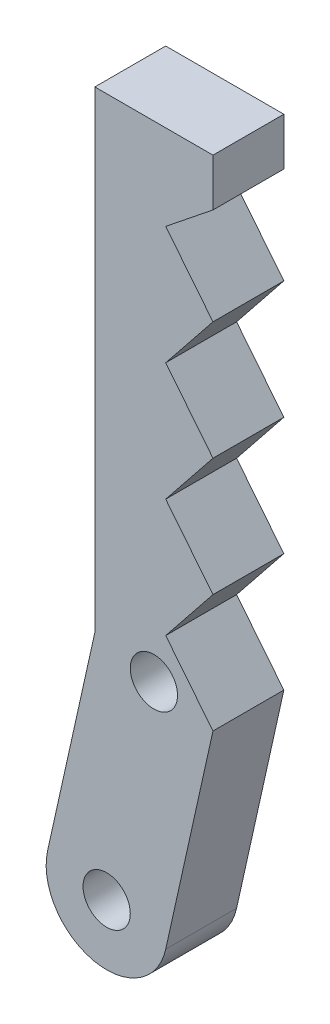
ISO-10303-21;
HEADER;
FILE_DESCRIPTION(('STEP AP214'),'2;1');
FILE_NAME('part.step','',(''),(''),'','','');
FILE_SCHEMA(('AUTOMOTIVE_DESIGN { 1 0 10303 214 1 1 1 1 }'));
ENDSEC;
DATA;
#1=APPLICATION_CONTEXT('core data for automotive mechanical design processes');
#2=APPLICATION_PROTOCOL_DEFINITION('international standard','automotive_design',2000,#1);
#3=PRODUCT_CONTEXT('',#1,'mechanical');
#4=PRODUCT('Part','Part','',(#3));
#5=PRODUCT_RELATED_PRODUCT_CATEGORY('part','',(#4));
#6=PRODUCT_DEFINITION_FORMATION('','',#4);
#7=PRODUCT_DEFINITION_CONTEXT('part definition',#1,'design');
#8=PRODUCT_DEFINITION('design','',#6,#7);
#9=PRODUCT_DEFINITION_SHAPE('','',#8);
#10=(LENGTH_UNIT() NAMED_UNIT(*) SI_UNIT(.MILLI.,.METRE.));
#11=(NAMED_UNIT(*) PLANE_ANGLE_UNIT() SI_UNIT($,.RADIAN.));
#12=(NAMED_UNIT(*) SI_UNIT($,.STERADIAN.) SOLID_ANGLE_UNIT());
#13=UNCERTAINTY_MEASURE_WITH_UNIT(LENGTH_MEASURE(1.E-05),#10,'distance_accuracy_value','');
#14=(GEOMETRIC_REPRESENTATION_CONTEXT(3) GLOBAL_UNCERTAINTY_ASSIGNED_CONTEXT((#13)) GLOBAL_UNIT_ASSIGNED_CONTEXT((#10,
#11,#12)) REPRESENTATION_CONTEXT('',''));
#15=CARTESIAN_POINT('',(0.,0.,0.));
#16=DIRECTION('',(0.,0.,1.));
#17=DIRECTION('',(1.,0.,0.));
#18=AXIS2_PLACEMENT_3D('',#15,#16,#17);
#19=CARTESIAN_POINT('',(-9.00000033147397,-18.981520896105,6.));
#20=DIRECTION('',(0.,0.,1.));
#21=DIRECTION('',(1.,0.,0.));
#22=AXIS2_PLACEMENT_3D('',#19,#20,#21);
#23=PLANE('',#22);
#24=CARTESIAN_POINT('',(-5.,-0.983289603235069,6.));
#25=DIRECTION('',(0.,0.,1.));
#26=DIRECTION('',(1.,0.,0.));
#27=AXIS2_PLACEMENT_3D('',#24,#25,#26);
#28=CIRCLE('',#27,2.);
#29=CARTESIAN_POINT('',(-3.,-0.983289603235069,6.));
#30=VERTEX_POINT('',#29);
#31=EDGE_CURVE('E170',#30,#30,#28,.T.);
#32=ORIENTED_EDGE('',*,*,#31,.F.);
#33=EDGE_LOOP('',(#32));
#34=FACE_BOUND('',#33,.T.);
#35=DIRECTION('',(-1.,0.,0.));
#36=VECTOR('',#35,1.);
#37=CARTESIAN_POINT('',(0.,40.1279306935094,6.));
#38=LINE('',#37,#36);
#39=CARTESIAN_POINT('',(0.,40.1279306935094,6.));
#40=VERTEX_POINT('',#39);
#41=CARTESIAN_POINT('',(-10.,40.1279306935094,6.));
#42=VERTEX_POINT('',#41);
#43=EDGE_CURVE('E193',#40,#42,#38,.T.);
#44=ORIENTED_EDGE('',*,*,#43,.T.);
#45=DIRECTION('',(0.,-1.,0.));
#46=VECTOR('',#45,1.);
#47=CARTESIAN_POINT('',(-10.,40.1279306935094,6.));
#48=LINE('',#47,#46);
#49=CARTESIAN_POINT('',(-10.,0.127930693509376,6.));
#50=VERTEX_POINT('',#49);
#51=EDGE_CURVE('E111',#42,#50,#48,.T.);
#52=ORIENTED_EDGE('',*,*,#51,.T.);
#53=DIRECTION('',(-0.216950771639621,-0.976182545779719,0.));
#54=VECTOR('',#53,1.);
#55=CARTESIAN_POINT('',(-10.,0.127930693509376,6.));
#56=LINE('',#55,#54);
#57=CARTESIAN_POINT('',(-14.0005722290346,-17.8728754506686,6.));
#58=VERTEX_POINT('',#57);
#59=EDGE_CURVE('E226',#50,#58,#56,.T.);
#60=ORIENTED_EDGE('',*,*,#59,.T.);
#61=CARTESIAN_POINT('',(-9.00000033147397,-18.981520896105,6.));
#62=DIRECTION('',(0.,0.,1.));
#63=DIRECTION('',(1.,0.,0.));
#64=AXIS2_PLACEMENT_3D('',#61,#62,#63);
#65=CIRCLE('',#64,5.12199316930039);
#66=CARTESIAN_POINT('',(-3.99999999999999,-20.0927412665176,6.));
#67=VERTEX_POINT('',#66);
#68=EDGE_CURVE('E245',#58,#67,#65,.T.);
#69=ORIENTED_EDGE('',*,*,#68,.T.);
#70=DIRECTION('',(0.216950771639622,0.976182545779719,0.));
#71=VECTOR('',#70,1.);
#72=CARTESIAN_POINT('',(0.,-2.09450989997951,6.));
#73=LINE('',#72,#71);
#74=CARTESIAN_POINT('',(0.,-2.09450989997951,6.));
#75=VERTEX_POINT('',#74);
#76=EDGE_CURVE('E242',#67,#75,#73,.T.);
#77=ORIENTED_EDGE('',*,*,#76,.T.);
#78=DIRECTION('',(-0.624695047554424,0.780868809443031,0.));
#79=VECTOR('',#78,1.);
#80=CARTESIAN_POINT('',(0.,-2.09450989997951,6.));
#81=LINE('',#80,#79);
#82=CARTESIAN_POINT('',(-4.,2.90549010002049,6.));
#83=VERTEX_POINT('',#82);
#84=EDGE_CURVE('E244',#75,#83,#81,.T.);
#85=ORIENTED_EDGE('',*,*,#84,.T.);
#86=DIRECTION('',(0.624695047554424,0.78086880944303,0.));
#87=VECTOR('',#86,1.);
#88=CARTESIAN_POINT('',(-4.,2.90549010002049,6.));
#89=LINE('',#88,#87);
#90=CARTESIAN_POINT('',(0.,7.90549010002049,6.));
#91=VERTEX_POINT('',#90);
#92=EDGE_CURVE('E247',#83,#91,#89,.T.);
#93=ORIENTED_EDGE('',*,*,#92,.T.);
#94=DIRECTION('',(-0.624695047554424,0.780868809443031,0.));
#95=VECTOR('',#94,1.);
#96=CARTESIAN_POINT('',(0.,7.90549010002049,6.));
#97=LINE('',#96,#95);
#98=CARTESIAN_POINT('',(-3.99999999999999,12.9054901000205,6.));
#99=VERTEX_POINT('',#98);
#100=EDGE_CURVE('E253',#91,#99,#97,.T.);
#101=ORIENTED_EDGE('',*,*,#100,.T.);
#102=DIRECTION('',(0.624695047554423,0.780868809443031,0.));
#103=VECTOR('',#102,1.);
#104=CARTESIAN_POINT('',(-3.99999999999999,12.9054901000205,6.));
#105=LINE('',#104,#103);
#106=CARTESIAN_POINT('',(0.,17.9054901000205,6.));
#107=VERTEX_POINT('',#106);
#108=EDGE_CURVE('E255',#99,#107,#105,.T.);
#109=ORIENTED_EDGE('',*,*,#108,.T.);
#110=DIRECTION('',(-0.624695047554424,0.780868809443031,0.));
#111=VECTOR('',#110,1.);
#112=CARTESIAN_POINT('',(0.,17.9054901000205,6.));
#113=LINE('',#112,#111);
#114=CARTESIAN_POINT('',(-3.99999999999999,22.9054901000205,6.));
#115=VERTEX_POINT('',#114);
#116=EDGE_CURVE('E257',#107,#115,#113,.T.);
#117=ORIENTED_EDGE('',*,*,#116,.T.);
#118=DIRECTION('',(0.624695047554423,0.780868809443031,0.));
#119=VECTOR('',#118,1.);
#120=CARTESIAN_POINT('',(-3.99999999999999,22.9054901000205,6.));
#121=LINE('',#120,#119);
#122=CARTESIAN_POINT('',(0.,27.9054901000205,6.));
#123=VERTEX_POINT('',#122);
#124=EDGE_CURVE('E148',#115,#123,#121,.T.);
#125=ORIENTED_EDGE('',*,*,#124,.T.);
#126=DIRECTION('',(-0.624695047554424,0.780868809443031,0.));
#127=VECTOR('',#126,1.);
#128=CARTESIAN_POINT('',(0.,27.9054901000205,6.));
#129=LINE('',#128,#127);
#130=CARTESIAN_POINT('',(-3.99999999999999,32.9054901000205,6.));
#131=VERTEX_POINT('',#130);
#132=EDGE_CURVE('E142',#123,#131,#129,.T.);
#133=ORIENTED_EDGE('',*,*,#132,.T.);
#134=DIRECTION('',(0.780868809443031,0.624695047554424,0.));
#135=VECTOR('',#134,1.);
#136=CARTESIAN_POINT('',(-3.99999999999999,32.9054901000205,6.));
#137=LINE('',#136,#135);
#138=CARTESIAN_POINT('',(0.,36.1054901000205,6.));
#139=VERTEX_POINT('',#138);
#140=EDGE_CURVE('E146',#131,#139,#137,.T.);
#141=ORIENTED_EDGE('',*,*,#140,.T.);
#142=DIRECTION('',(0.,1.,0.));
#143=VECTOR('',#142,1.);
#144=CARTESIAN_POINT('',(0.,36.1054901000205,6.));
#145=LINE('',#144,#143);
#146=EDGE_CURVE('E50',#139,#40,#145,.T.);
#147=ORIENTED_EDGE('',*,*,#146,.T.);
#148=EDGE_LOOP('',(#44,#52,#60,#69,#77,#85,#93,#101,#109,#117,#125,#133,#141,#147));
#149=FACE_BOUND('',#148,.T.);
#150=CARTESIAN_POINT('',(-9.00000033147397,-18.981520896105,6.));
#151=DIRECTION('',(0.,0.,1.));
#152=DIRECTION('',(1.,0.,0.));
#153=AXIS2_PLACEMENT_3D('',#150,#151,#152);
#154=CIRCLE('',#153,2.);
#155=CARTESIAN_POINT('',(-7.00000033147397,-18.981520896105,6.));
#156=VERTEX_POINT('',#155);
#157=EDGE_CURVE('E299',#156,#156,#154,.T.);
#158=ORIENTED_EDGE('',*,*,#157,.F.);
#159=EDGE_LOOP('',(#158));
#160=FACE_BOUND('',#159,.T.);
#161=ADVANCED_FACE('F33',(#34,#149,#160),#23,.T.);
#162=CARTESIAN_POINT('',(-9.00000033147397,-18.981520896105,0.));
#163=DIRECTION('',(0.,0.,1.));
#164=DIRECTION('',(1.,0.,0.));
#165=AXIS2_PLACEMENT_3D('',#162,#163,#164);
#166=PLANE('',#165);
#167=DIRECTION('',(-1.,0.,0.));
#168=VECTOR('',#167,1.);
#169=CARTESIAN_POINT('',(0.,40.1279306935094,0.));
#170=LINE('',#169,#168);
#171=CARTESIAN_POINT('',(0.,40.1279306935094,0.));
#172=VERTEX_POINT('',#171);
#173=CARTESIAN_POINT('',(-10.,40.1279306935094,0.));
#174=VERTEX_POINT('',#173);
#175=EDGE_CURVE('E166',#172,#174,#170,.T.);
#176=ORIENTED_EDGE('',*,*,#175,.F.);
#177=DIRECTION('',(0.,1.,0.));
#178=VECTOR('',#177,1.);
#179=CARTESIAN_POINT('',(0.,36.1054901000205,0.));
#180=LINE('',#179,#178);
#181=CARTESIAN_POINT('',(0.,36.1054901000205,0.));
#182=VERTEX_POINT('',#181);
#183=EDGE_CURVE('E103',#182,#172,#180,.T.);
#184=ORIENTED_EDGE('',*,*,#183,.F.);
#185=DIRECTION('',(0.780868809443031,0.624695047554424,0.));
#186=VECTOR('',#185,1.);
#187=CARTESIAN_POINT('',(-3.99999999999999,32.9054901000205,0.));
#188=LINE('',#187,#186);
#189=CARTESIAN_POINT('',(-3.99999999999999,32.9054901000205,0.));
#190=VERTEX_POINT('',#189);
#191=EDGE_CURVE('E97',#190,#182,#188,.T.);
#192=ORIENTED_EDGE('',*,*,#191,.F.);
#193=DIRECTION('',(-0.624695047554424,0.780868809443031,0.));
#194=VECTOR('',#193,1.);
#195=CARTESIAN_POINT('',(0.,27.9054901000205,0.));
#196=LINE('',#195,#194);
#197=CARTESIAN_POINT('',(0.,27.9054901000205,0.));
#198=VERTEX_POINT('',#197);
#199=EDGE_CURVE('E156',#198,#190,#196,.T.);
#200=ORIENTED_EDGE('',*,*,#199,.F.);
#201=DIRECTION('',(0.624695047554423,0.780868809443031,0.));
#202=VECTOR('',#201,1.);
#203=CARTESIAN_POINT('',(-3.99999999999999,22.9054901000205,0.));
#204=LINE('',#203,#202);
#205=CARTESIAN_POINT('',(-3.99999999999999,22.9054901000205,0.));
#206=VERTEX_POINT('',#205);
#207=EDGE_CURVE('E188',#206,#198,#204,.T.);
#208=ORIENTED_EDGE('',*,*,#207,.F.);
#209=DIRECTION('',(-0.624695047554424,0.780868809443031,0.));
#210=VECTOR('',#209,1.);
#211=CARTESIAN_POINT('',(0.,17.9054901000205,0.));
#212=LINE('',#211,#210);
#213=CARTESIAN_POINT('',(0.,17.9054901000205,0.));
#214=VERTEX_POINT('',#213);
#215=EDGE_CURVE('E186',#214,#206,#212,.T.);
#216=ORIENTED_EDGE('',*,*,#215,.F.);
#217=DIRECTION('',(0.624695047554423,0.780868809443031,0.));
#218=VECTOR('',#217,1.);
#219=CARTESIAN_POINT('',(-3.99999999999999,12.9054901000205,0.));
#220=LINE('',#219,#218);
#221=CARTESIAN_POINT('',(-3.99999999999999,12.9054901000205,0.));
#222=VERTEX_POINT('',#221);
#223=EDGE_CURVE('E184',#222,#214,#220,.T.);
#224=ORIENTED_EDGE('',*,*,#223,.F.);
#225=DIRECTION('',(-0.624695047554424,0.780868809443031,0.));
#226=VECTOR('',#225,1.);
#227=CARTESIAN_POINT('',(0.,7.90549010002049,0.));
#228=LINE('',#227,#226);
#229=CARTESIAN_POINT('',(0.,7.90549010002049,0.));
#230=VERTEX_POINT('',#229);
#231=EDGE_CURVE('E182',#230,#222,#228,.T.);
#232=ORIENTED_EDGE('',*,*,#231,.F.);
#233=DIRECTION('',(0.624695047554424,0.78086880944303,0.));
#234=VECTOR('',#233,1.);
#235=CARTESIAN_POINT('',(-4.,2.90549010002049,0.));
#236=LINE('',#235,#234);
#237=CARTESIAN_POINT('',(-4.,2.90549010002049,0.));
#238=VERTEX_POINT('',#237);
#239=EDGE_CURVE('E180',#238,#230,#236,.T.);
#240=ORIENTED_EDGE('',*,*,#239,.F.);
#241=DIRECTION('',(-0.624695047554424,0.780868809443031,0.));
#242=VECTOR('',#241,1.);
#243=CARTESIAN_POINT('',(0.,-2.09450989997951,0.));
#244=LINE('',#243,#242);
#245=CARTESIAN_POINT('',(0.,-2.09450989997951,0.));
#246=VERTEX_POINT('',#245);
#247=EDGE_CURVE('E178',#246,#238,#244,.T.);
#248=ORIENTED_EDGE('',*,*,#247,.F.);
#249=DIRECTION('',(0.216950771639622,0.976182545779719,0.));
#250=VECTOR('',#249,1.);
#251=CARTESIAN_POINT('',(0.,-2.09450989997951,0.));
#252=LINE('',#251,#250);
#253=CARTESIAN_POINT('',(-3.99999999999999,-20.0927412665176,0.));
#254=VERTEX_POINT('',#253);
#255=EDGE_CURVE('E176',#254,#246,#252,.T.);
#256=ORIENTED_EDGE('',*,*,#255,.F.);
#257=CARTESIAN_POINT('',(-9.00000033147397,-18.981520896105,0.));
#258=DIRECTION('',(0.,0.,1.));
#259=DIRECTION('',(1.,0.,0.));
#260=AXIS2_PLACEMENT_3D('',#257,#258,#259);
#261=CIRCLE('',#260,5.12199316930039);
#262=CARTESIAN_POINT('',(-14.0005722290346,-17.8728754506686,0.));
#263=VERTEX_POINT('',#262);
#264=EDGE_CURVE('E174',#263,#254,#261,.T.);
#265=ORIENTED_EDGE('',*,*,#264,.F.);
#266=DIRECTION('',(-0.216950771639621,-0.976182545779719,0.));
#267=VECTOR('',#266,1.);
#268=CARTESIAN_POINT('',(-10.,0.127930693509376,0.));
#269=LINE('',#268,#267);
#270=CARTESIAN_POINT('',(-10.,0.127930693509376,0.));
#271=VERTEX_POINT('',#270);
#272=EDGE_CURVE('E172',#271,#263,#269,.T.);
#273=ORIENTED_EDGE('',*,*,#272,.F.);
#274=DIRECTION('',(0.,-1.,0.));
#275=VECTOR('',#274,1.);
#276=CARTESIAN_POINT('',(-10.,40.1279306935094,0.));
#277=LINE('',#276,#275);
#278=EDGE_CURVE('E169',#174,#271,#277,.T.);
#279=ORIENTED_EDGE('',*,*,#278,.F.);
#280=EDGE_LOOP('',(#176,#184,#192,#200,#208,#216,#224,#232,#240,#248,#256,#265,#273,#279));
#281=FACE_BOUND('',#280,.T.);
#282=CARTESIAN_POINT('',(-5.,-0.983289603235069,0.));
#283=DIRECTION('',(0.,0.,1.));
#284=DIRECTION('',(1.,0.,0.));
#285=AXIS2_PLACEMENT_3D('',#282,#283,#284);
#286=CIRCLE('',#285,2.);
#287=CARTESIAN_POINT('',(-3.,-0.983289603235069,0.));
#288=VERTEX_POINT('',#287);
#289=EDGE_CURVE('E305',#288,#288,#286,.T.);
#290=ORIENTED_EDGE('',*,*,#289,.T.);
#291=EDGE_LOOP('',(#290));
#292=FACE_BOUND('',#291,.T.);
#293=CARTESIAN_POINT('',(-9.00000033147397,-18.981520896105,0.));
#294=DIRECTION('',(0.,0.,1.));
#295=DIRECTION('',(1.,0.,0.));
#296=AXIS2_PLACEMENT_3D('',#293,#294,#295);
#297=CIRCLE('',#296,2.);
#298=CARTESIAN_POINT('',(-7.00000033147397,-18.981520896105,0.));
#299=VERTEX_POINT('',#298);
#300=EDGE_CURVE('E302',#299,#299,#297,.T.);
#301=ORIENTED_EDGE('',*,*,#300,.T.);
#302=EDGE_LOOP('',(#301));
#303=FACE_BOUND('',#302,.T.);
#304=ADVANCED_FACE('F230',(#281,#292,#303),#166,.F.);
#305=CARTESIAN_POINT('',(0.,40.1279306935094,6.));
#306=DIRECTION('',(0.,-1.,0.));
#307=DIRECTION('',(0.,0.,-1.));
#308=AXIS2_PLACEMENT_3D('',#305,#306,#307);
#309=PLANE('',#308);
#310=ORIENTED_EDGE('',*,*,#175,.T.);
#311=DIRECTION('',(0.,0.,-1.));
#312=VECTOR('',#311,1.);
#313=CARTESIAN_POINT('',(-10.,40.1279306935094,6.));
#314=LINE('',#313,#312);
#315=EDGE_CURVE('E11',#42,#174,#314,.T.);
#316=ORIENTED_EDGE('',*,*,#315,.F.);
#317=ORIENTED_EDGE('',*,*,#43,.F.);
#318=DIRECTION('',(0.,0.,-1.));
#319=VECTOR('',#318,1.);
#320=CARTESIAN_POINT('',(0.,40.1279306935094,6.));
#321=LINE('',#320,#319);
#322=EDGE_CURVE('E162',#40,#172,#321,.T.);
#323=ORIENTED_EDGE('',*,*,#322,.T.);
#324=EDGE_LOOP('',(#310,#316,#317,#323));
#325=FACE_BOUND('',#324,.T.);
#326=ADVANCED_FACE('F35',(#325),#309,.F.);
#327=CARTESIAN_POINT('',(-10.,40.1279306935094,6.));
#328=DIRECTION('',(1.,0.,0.));
#329=DIRECTION('',(0.,1.,0.));
#330=AXIS2_PLACEMENT_3D('',#327,#328,#329);
#331=PLANE('',#330);
#332=ORIENTED_EDGE('',*,*,#278,.T.);
#333=DIRECTION('',(0.,0.,-1.));
#334=VECTOR('',#333,1.);
#335=CARTESIAN_POINT('',(-10.,0.127930693509376,6.));
#336=LINE('',#335,#334);
#337=EDGE_CURVE('E42',#50,#271,#336,.T.);
#338=ORIENTED_EDGE('',*,*,#337,.F.);
#339=ORIENTED_EDGE('',*,*,#51,.F.);
#340=ORIENTED_EDGE('',*,*,#315,.T.);
#341=EDGE_LOOP('',(#332,#338,#339,#340));
#342=FACE_BOUND('',#341,.T.);
#343=ADVANCED_FACE('F418',(#342),#331,.F.);
#344=CARTESIAN_POINT('',(-10.,0.127930693509376,6.));
#345=DIRECTION('',(0.976182545779719,-0.216950771639621,0.));
#346=DIRECTION('',(0.216950771639621,0.976182545779719,0.));
#347=AXIS2_PLACEMENT_3D('',#344,#345,#346);
#348=PLANE('',#347);
#349=ORIENTED_EDGE('',*,*,#272,.T.);
#350=DIRECTION('',(0.,0.,-1.));
#351=VECTOR('',#350,1.);
#352=CARTESIAN_POINT('',(-14.0005722290346,-17.8728754506686,6.));
#353=LINE('',#352,#351);
#354=EDGE_CURVE('E218',#58,#263,#353,.T.);
#355=ORIENTED_EDGE('',*,*,#354,.F.);
#356=ORIENTED_EDGE('',*,*,#59,.F.);
#357=ORIENTED_EDGE('',*,*,#337,.T.);
#358=EDGE_LOOP('',(#349,#355,#356,#357));
#359=FACE_BOUND('',#358,.T.);
#360=ADVANCED_FACE('F224',(#359),#348,.F.);
#361=CARTESIAN_POINT('',(-9.00000033147397,-18.981520896105,6.));
#362=DIRECTION('',(0.,0.,-1.));
#363=DIRECTION('',(-1.,0.,0.));
#364=AXIS2_PLACEMENT_3D('',#361,#362,#363);
#365=CYLINDRICAL_SURFACE('',#364,5.12199316930039);
#366=ORIENTED_EDGE('',*,*,#264,.T.);
#367=DIRECTION('',(0.,0.,-1.));
#368=VECTOR('',#367,1.);
#369=CARTESIAN_POINT('',(-3.99999999999999,-20.0927412665176,6.));
#370=LINE('',#369,#368);
#371=EDGE_CURVE('E215',#67,#254,#370,.T.);
#372=ORIENTED_EDGE('',*,*,#371,.F.);
#373=ORIENTED_EDGE('',*,*,#68,.F.);
#374=ORIENTED_EDGE('',*,*,#354,.T.);
#375=EDGE_LOOP('',(#366,#372,#373,#374));
#376=FACE_BOUND('',#375,.T.);
#377=ADVANCED_FACE('F236',(#376),#365,.T.);
#378=CARTESIAN_POINT('',(0.,-2.09450989997951,6.));
#379=DIRECTION('',(-0.976182545779719,0.216950771639621,0.));
#380=DIRECTION('',(-0.216950771639622,-0.976182545779719,0.));
#381=AXIS2_PLACEMENT_3D('',#378,#379,#380);
#382=PLANE('',#381);
#383=ORIENTED_EDGE('',*,*,#255,.T.);
#384=DIRECTION('',(0.,0.,-1.));
#385=VECTOR('',#384,1.);
#386=CARTESIAN_POINT('',(0.,-2.09450989997951,6.));
#387=LINE('',#386,#385);
#388=EDGE_CURVE('E212',#75,#246,#387,.T.);
#389=ORIENTED_EDGE('',*,*,#388,.F.);
#390=ORIENTED_EDGE('',*,*,#76,.F.);
#391=ORIENTED_EDGE('',*,*,#371,.T.);
#392=EDGE_LOOP('',(#383,#389,#390,#391));
#393=FACE_BOUND('',#392,.T.);
#394=ADVANCED_FACE('F240',(#393),#382,.F.);
#395=CARTESIAN_POINT('',(0.,-2.09450989997951,6.));
#396=DIRECTION('',(-0.78086880944303,-0.624695047554424,0.));
#397=DIRECTION('',(0.624695047554424,-0.780868809443031,0.));
#398=AXIS2_PLACEMENT_3D('',#395,#396,#397);
#399=PLANE('',#398);
#400=ORIENTED_EDGE('',*,*,#247,.T.);
#401=DIRECTION('',(0.,0.,-1.));
#402=VECTOR('',#401,1.);
#403=CARTESIAN_POINT('',(-4.,2.90549010002049,6.));
#404=LINE('',#403,#402);
#405=EDGE_CURVE('E209',#83,#238,#404,.T.);
#406=ORIENTED_EDGE('',*,*,#405,.F.);
#407=ORIENTED_EDGE('',*,*,#84,.F.);
#408=ORIENTED_EDGE('',*,*,#388,.T.);
#409=EDGE_LOOP('',(#400,#406,#407,#408));
#410=FACE_BOUND('',#409,.T.);
#411=ADVANCED_FACE('F383',(#410),#399,.F.);
#412=CARTESIAN_POINT('',(-4.,2.90549010002049,6.));
#413=DIRECTION('',(-0.78086880944303,0.624695047554424,0.));
#414=DIRECTION('',(-0.624695047554424,-0.78086880944303,0.));
#415=AXIS2_PLACEMENT_3D('',#412,#413,#414);
#416=PLANE('',#415);
#417=ORIENTED_EDGE('',*,*,#239,.T.);
#418=DIRECTION('',(0.,0.,-1.));
#419=VECTOR('',#418,1.);
#420=CARTESIAN_POINT('',(0.,7.90549010002049,6.));
#421=LINE('',#420,#419);
#422=EDGE_CURVE('E206',#91,#230,#421,.T.);
#423=ORIENTED_EDGE('',*,*,#422,.F.);
#424=ORIENTED_EDGE('',*,*,#92,.F.);
#425=ORIENTED_EDGE('',*,*,#405,.T.);
#426=EDGE_LOOP('',(#417,#423,#424,#425));
#427=FACE_BOUND('',#426,.T.);
#428=ADVANCED_FACE('F373',(#427),#416,.F.);
#429=CARTESIAN_POINT('',(0.,7.90549010002049,6.));
#430=DIRECTION('',(-0.780868809443031,-0.624695047554424,0.));
#431=DIRECTION('',(0.624695047554424,-0.780868809443031,0.));
#432=AXIS2_PLACEMENT_3D('',#429,#430,#431);
#433=PLANE('',#432);
#434=ORIENTED_EDGE('',*,*,#231,.T.);
#435=DIRECTION('',(0.,0.,-1.));
#436=VECTOR('',#435,1.);
#437=CARTESIAN_POINT('',(-3.99999999999999,12.9054901000205,6.));
#438=LINE('',#437,#436);
#439=EDGE_CURVE('E203',#99,#222,#438,.T.);
#440=ORIENTED_EDGE('',*,*,#439,.F.);
#441=ORIENTED_EDGE('',*,*,#100,.F.);
#442=ORIENTED_EDGE('',*,*,#422,.T.);
#443=EDGE_LOOP('',(#434,#440,#441,#442));
#444=FACE_BOUND('',#443,.T.);
#445=ADVANCED_FACE('F363',(#444),#433,.F.);
#446=CARTESIAN_POINT('',(-3.99999999999999,12.9054901000205,6.));
#447=DIRECTION('',(-0.780868809443031,0.624695047554423,0.));
#448=DIRECTION('',(-0.624695047554423,-0.780868809443031,0.));
#449=AXIS2_PLACEMENT_3D('',#446,#447,#448);
#450=PLANE('',#449);
#451=ORIENTED_EDGE('',*,*,#223,.T.);
#452=DIRECTION('',(0.,0.,-1.));
#453=VECTOR('',#452,1.);
#454=CARTESIAN_POINT('',(0.,17.9054901000205,6.));
#455=LINE('',#454,#453);
#456=EDGE_CURVE('E200',#107,#214,#455,.T.);
#457=ORIENTED_EDGE('',*,*,#456,.F.);
#458=ORIENTED_EDGE('',*,*,#108,.F.);
#459=ORIENTED_EDGE('',*,*,#439,.T.);
#460=EDGE_LOOP('',(#451,#457,#458,#459));
#461=FACE_BOUND('',#460,.T.);
#462=ADVANCED_FACE('F354',(#461),#450,.F.);
#463=CARTESIAN_POINT('',(0.,17.9054901000205,6.));
#464=DIRECTION('',(-0.780868809443031,-0.624695047554424,0.));
#465=DIRECTION('',(0.624695047554424,-0.780868809443031,0.));
#466=AXIS2_PLACEMENT_3D('',#463,#464,#465);
#467=PLANE('',#466);
#468=ORIENTED_EDGE('',*,*,#215,.T.);
#469=DIRECTION('',(0.,0.,-1.));
#470=VECTOR('',#469,1.);
#471=CARTESIAN_POINT('',(-3.99999999999999,22.9054901000205,6.));
#472=LINE('',#471,#470);
#473=EDGE_CURVE('E197',#115,#206,#472,.T.);
#474=ORIENTED_EDGE('',*,*,#473,.F.);
#475=ORIENTED_EDGE('',*,*,#116,.F.);
#476=ORIENTED_EDGE('',*,*,#456,.T.);
#477=EDGE_LOOP('',(#468,#474,#475,#476));
#478=FACE_BOUND('',#477,.T.);
#479=ADVANCED_FACE('F263',(#478),#467,.F.);
#480=CARTESIAN_POINT('',(-3.99999999999999,22.9054901000205,6.));
#481=DIRECTION('',(-0.780868809443031,0.624695047554423,0.));
#482=DIRECTION('',(-0.624695047554423,-0.780868809443031,0.));
#483=AXIS2_PLACEMENT_3D('',#480,#481,#482);
#484=PLANE('',#483);
#485=ORIENTED_EDGE('',*,*,#207,.T.);
#486=DIRECTION('',(0.,0.,-1.));
#487=VECTOR('',#486,1.);
#488=CARTESIAN_POINT('',(0.,27.9054901000205,6.));
#489=LINE('',#488,#487);
#490=EDGE_CURVE('E157',#123,#198,#489,.T.);
#491=ORIENTED_EDGE('',*,*,#490,.F.);
#492=ORIENTED_EDGE('',*,*,#124,.F.);
#493=ORIENTED_EDGE('',*,*,#473,.T.);
#494=EDGE_LOOP('',(#485,#491,#492,#493));
#495=FACE_BOUND('',#494,.T.);
#496=ADVANCED_FACE('F267',(#495),#484,.F.);
#497=CARTESIAN_POINT('',(0.,27.9054901000205,6.));
#498=DIRECTION('',(-0.780868809443031,-0.624695047554424,0.));
#499=DIRECTION('',(0.624695047554424,-0.780868809443031,0.));
#500=AXIS2_PLACEMENT_3D('',#497,#498,#499);
#501=PLANE('',#500);
#502=ORIENTED_EDGE('',*,*,#199,.T.);
#503=DIRECTION('',(0.,0.,-1.));
#504=VECTOR('',#503,1.);
#505=CARTESIAN_POINT('',(-3.99999999999999,32.9054901000205,6.));
#506=LINE('',#505,#504);
#507=EDGE_CURVE('E153',#131,#190,#506,.T.);
#508=ORIENTED_EDGE('',*,*,#507,.F.);
#509=ORIENTED_EDGE('',*,*,#132,.F.);
#510=ORIENTED_EDGE('',*,*,#490,.T.);
#511=EDGE_LOOP('',(#502,#508,#509,#510));
#512=FACE_BOUND('',#511,.T.);
#513=ADVANCED_FACE('F154',(#512),#501,.F.);
#514=CARTESIAN_POINT('',(-3.99999999999999,32.9054901000205,6.));
#515=DIRECTION('',(-0.624695047554424,0.780868809443031,0.));
#516=DIRECTION('',(-0.780868809443031,-0.624695047554424,0.));
#517=AXIS2_PLACEMENT_3D('',#514,#515,#516);
#518=PLANE('',#517);
#519=ORIENTED_EDGE('',*,*,#191,.T.);
#520=DIRECTION('',(0.,0.,-1.));
#521=VECTOR('',#520,1.);
#522=CARTESIAN_POINT('',(0.,36.1054901000205,6.));
#523=LINE('',#522,#521);
#524=EDGE_CURVE('E158',#139,#182,#523,.T.);
#525=ORIENTED_EDGE('',*,*,#524,.F.);
#526=ORIENTED_EDGE('',*,*,#140,.F.);
#527=ORIENTED_EDGE('',*,*,#507,.T.);
#528=EDGE_LOOP('',(#519,#525,#526,#527));
#529=FACE_BOUND('',#528,.T.);
#530=ADVANCED_FACE('F160',(#529),#518,.F.);
#531=CARTESIAN_POINT('',(0.,36.1054901000205,6.));
#532=DIRECTION('',(-1.,0.,0.));
#533=DIRECTION('',(0.,-1.,0.));
#534=AXIS2_PLACEMENT_3D('',#531,#532,#533);
#535=PLANE('',#534);
#536=ORIENTED_EDGE('',*,*,#183,.T.);
#537=ORIENTED_EDGE('',*,*,#322,.F.);
#538=ORIENTED_EDGE('',*,*,#146,.F.);
#539=ORIENTED_EDGE('',*,*,#524,.T.);
#540=EDGE_LOOP('',(#536,#537,#538,#539));
#541=FACE_BOUND('',#540,.T.);
#542=ADVANCED_FACE('F271',(#541),#535,.F.);
#543=CARTESIAN_POINT('',(-5.,-0.983289603235069,6.));
#544=DIRECTION('',(0.,0.,-1.));
#545=DIRECTION('',(-1.,0.,0.));
#546=AXIS2_PLACEMENT_3D('',#543,#544,#545);
#547=CYLINDRICAL_SURFACE('',#546,2.);
#548=ORIENTED_EDGE('',*,*,#31,.T.);
#549=EDGE_LOOP('',(#548));
#550=FACE_BOUND('',#549,.T.);
#551=ORIENTED_EDGE('',*,*,#289,.F.);
#552=EDGE_LOOP('',(#551));
#553=FACE_BOUND('',#552,.T.);
#554=ADVANCED_FACE('F273',(#550,#553),#547,.F.);
#555=CARTESIAN_POINT('',(-9.00000033147397,-18.981520896105,6.));
#556=DIRECTION('',(0.,0.,-1.));
#557=DIRECTION('',(-1.,0.,0.));
#558=AXIS2_PLACEMENT_3D('',#555,#556,#557);
#559=CYLINDRICAL_SURFACE('',#558,2.);
#560=ORIENTED_EDGE('',*,*,#157,.T.);
#561=EDGE_LOOP('',(#560));
#562=FACE_BOUND('',#561,.T.);
#563=ORIENTED_EDGE('',*,*,#300,.F.);
#564=EDGE_LOOP('',(#563));
#565=FACE_BOUND('',#564,.T.);
#566=ADVANCED_FACE('F279',(#562,#565),#559,.F.);
#567=CLOSED_SHELL('',(#161,#304,#326,#343,#360,#377,#394,#411,#428,#445,#462,#479,#496,#513,
#530,#542,#554,#566));
#568=MANIFOLD_SOLID_BREP('B2',#567);
#569=ADVANCED_BREP_SHAPE_REPRESENTATION('',(#18,#568),#14);
#570=SHAPE_DEFINITION_REPRESENTATION(#9,#569);
ENDSEC;
END-ISO-10303-21;
